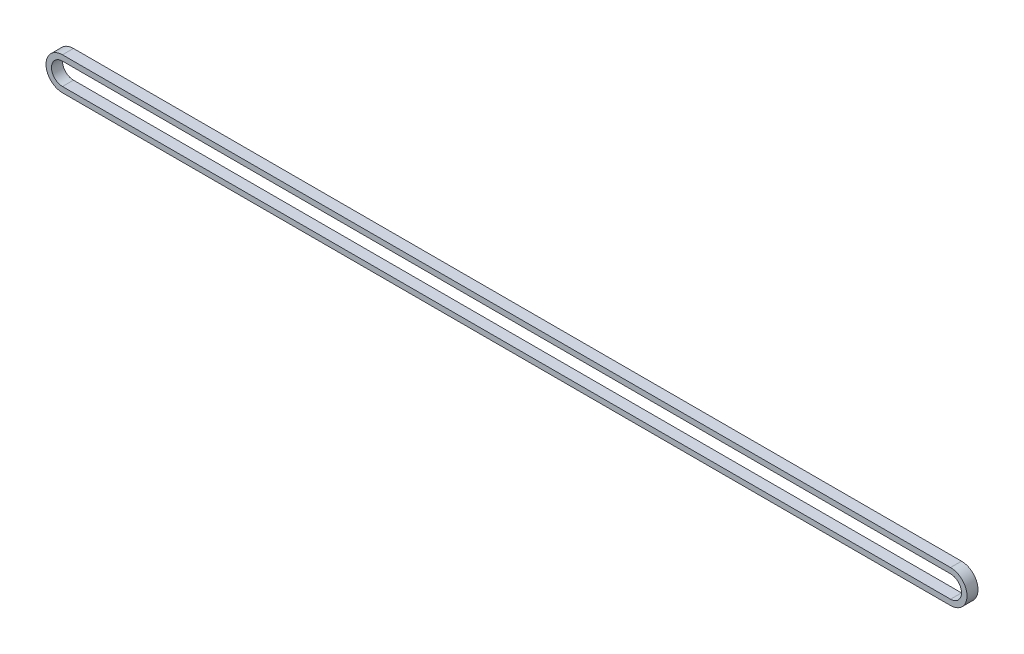
ISO-10303-21;
HEADER;
FILE_DESCRIPTION(('STEP AP214'),'2;1');
FILE_NAME('part.step','',(''),(''),'','','');
FILE_SCHEMA(('AUTOMOTIVE_DESIGN { 1 0 10303 214 1 1 1 1 }'));
ENDSEC;
DATA;
#1=APPLICATION_CONTEXT('core data for automotive mechanical design processes');
#2=APPLICATION_PROTOCOL_DEFINITION('international standard','automotive_design',2000,#1);
#3=PRODUCT_CONTEXT('',#1,'mechanical');
#4=PRODUCT('Part','Part','',(#3));
#5=PRODUCT_RELATED_PRODUCT_CATEGORY('part','',(#4));
#6=PRODUCT_DEFINITION_FORMATION('','',#4);
#7=PRODUCT_DEFINITION_CONTEXT('part definition',#1,'design');
#8=PRODUCT_DEFINITION('design','',#6,#7);
#9=PRODUCT_DEFINITION_SHAPE('','',#8);
#10=(LENGTH_UNIT() NAMED_UNIT(*) SI_UNIT(.MILLI.,.METRE.));
#11=(NAMED_UNIT(*) PLANE_ANGLE_UNIT() SI_UNIT($,.RADIAN.));
#12=(NAMED_UNIT(*) SI_UNIT($,.STERADIAN.) SOLID_ANGLE_UNIT());
#13=UNCERTAINTY_MEASURE_WITH_UNIT(LENGTH_MEASURE(1.E-05),#10,'distance_accuracy_value','');
#14=(GEOMETRIC_REPRESENTATION_CONTEXT(3) GLOBAL_UNCERTAINTY_ASSIGNED_CONTEXT((#13)) GLOBAL_UNIT_ASSIGNED_CONTEXT((#10,
#11,#12)) REPRESENTATION_CONTEXT('',''));
#15=CARTESIAN_POINT('',(0.,0.,0.));
#16=DIRECTION('',(0.,0.,1.));
#17=DIRECTION('',(1.,0.,0.));
#18=AXIS2_PLACEMENT_3D('',#15,#16,#17);
#19=CARTESIAN_POINT('',(242.5,0.,6.));
#20=DIRECTION('',(0.,0.,-1.));
#21=DIRECTION('',(-1.,0.,0.));
#22=AXIS2_PLACEMENT_3D('',#19,#20,#21);
#23=PLANE('',#22);
#24=CARTESIAN_POINT('',(242.5,0.,6.));
#25=DIRECTION('',(0.,0.,1.));
#26=DIRECTION('',(-1.,0.,0.));
#27=AXIS2_PLACEMENT_3D('',#24,#25,#26);
#28=CIRCLE('',#27,9.00000000000001);
#29=CARTESIAN_POINT('',(242.5,-9.00000000000001,6.));
#30=VERTEX_POINT('',#29);
#31=CARTESIAN_POINT('',(242.5,9.00000000000001,6.));
#32=VERTEX_POINT('',#31);
#33=EDGE_CURVE('E140',#30,#32,#28,.T.);
#34=ORIENTED_EDGE('',*,*,#33,.T.);
#35=DIRECTION('',(-1.,0.,0.));
#36=VECTOR('',#35,1.);
#37=CARTESIAN_POINT('',(-242.5,9.00000000000001,6.));
#38=LINE('',#37,#36);
#39=CARTESIAN_POINT('',(-242.5,9.00000000000001,6.));
#40=VERTEX_POINT('',#39);
#41=EDGE_CURVE('E143',#32,#40,#38,.T.);
#42=ORIENTED_EDGE('',*,*,#41,.T.);
#43=CARTESIAN_POINT('',(-242.5,0.,6.));
#44=DIRECTION('',(0.,0.,1.));
#45=DIRECTION('',(1.,0.,0.));
#46=AXIS2_PLACEMENT_3D('',#43,#44,#45);
#47=CIRCLE('',#46,9.00000000000001);
#48=CARTESIAN_POINT('',(-242.5,-9.00000000000001,6.));
#49=VERTEX_POINT('',#48);
#50=EDGE_CURVE('E146',#40,#49,#47,.T.);
#51=ORIENTED_EDGE('',*,*,#50,.T.);
#52=DIRECTION('',(1.,0.,0.));
#53=VECTOR('',#52,1.);
#54=CARTESIAN_POINT('',(242.5,-9.00000000000001,6.));
#55=LINE('',#54,#53);
#56=EDGE_CURVE('E148',#49,#30,#55,.T.);
#57=ORIENTED_EDGE('',*,*,#56,.T.);
#58=EDGE_LOOP('',(#34,#42,#51,#57));
#59=FACE_BOUND('',#58,.T.);
#60=CARTESIAN_POINT('',(-242.5,0.,6.));
#61=DIRECTION('',(0.,0.,1.));
#62=DIRECTION('',(1.,0.,0.));
#63=AXIS2_PLACEMENT_3D('',#60,#61,#62);
#64=CIRCLE('',#63,6.00000000000002);
#65=CARTESIAN_POINT('',(-242.5,6.00000000000002,6.));
#66=VERTEX_POINT('',#65);
#67=CARTESIAN_POINT('',(-242.5,-6.00000000000002,6.));
#68=VERTEX_POINT('',#67);
#69=EDGE_CURVE('E104',#66,#68,#64,.T.);
#70=ORIENTED_EDGE('',*,*,#69,.F.);
#71=DIRECTION('',(-1.,0.,0.));
#72=VECTOR('',#71,1.);
#73=CARTESIAN_POINT('',(242.5,6.00000000000002,6.));
#74=LINE('',#73,#72);
#75=CARTESIAN_POINT('',(242.5,6.00000000000002,6.));
#76=VERTEX_POINT('',#75);
#77=EDGE_CURVE('E126',#76,#66,#74,.T.);
#78=ORIENTED_EDGE('',*,*,#77,.F.);
#79=CARTESIAN_POINT('',(242.5,0.,6.));
#80=DIRECTION('',(0.,0.,1.));
#81=DIRECTION('',(-1.,0.,0.));
#82=AXIS2_PLACEMENT_3D('',#79,#80,#81);
#83=CIRCLE('',#82,6.00000000000002);
#84=CARTESIAN_POINT('',(242.5,-6.00000000000002,6.));
#85=VERTEX_POINT('',#84);
#86=EDGE_CURVE('E124',#85,#76,#83,.T.);
#87=ORIENTED_EDGE('',*,*,#86,.F.);
#88=DIRECTION('',(1.,0.,0.));
#89=VECTOR('',#88,1.);
#90=CARTESIAN_POINT('',(-242.5,-6.00000000000002,6.));
#91=LINE('',#90,#89);
#92=EDGE_CURVE('E112',#68,#85,#91,.T.);
#93=ORIENTED_EDGE('',*,*,#92,.F.);
#94=EDGE_LOOP('',(#70,#78,#87,#93));
#95=FACE_BOUND('',#94,.T.);
#96=ADVANCED_FACE('F39',(#59,#95),#23,.F.);
#97=CARTESIAN_POINT('',(242.5,0.,0.));
#98=DIRECTION('',(0.,0.,-1.));
#99=DIRECTION('',(-1.,0.,0.));
#100=AXIS2_PLACEMENT_3D('',#97,#98,#99);
#101=PLANE('',#100);
#102=CARTESIAN_POINT('',(242.5,0.,0.));
#103=DIRECTION('',(0.,0.,1.));
#104=DIRECTION('',(-1.,0.,0.));
#105=AXIS2_PLACEMENT_3D('',#102,#103,#104);
#106=CIRCLE('',#105,9.00000000000001);
#107=CARTESIAN_POINT('',(242.5,-9.00000000000001,0.));
#108=VERTEX_POINT('',#107);
#109=CARTESIAN_POINT('',(242.5,9.00000000000001,0.));
#110=VERTEX_POINT('',#109);
#111=EDGE_CURVE('E120',#108,#110,#106,.T.);
#112=ORIENTED_EDGE('',*,*,#111,.F.);
#113=DIRECTION('',(1.,0.,0.));
#114=VECTOR('',#113,1.);
#115=CARTESIAN_POINT('',(242.5,-9.00000000000001,0.));
#116=LINE('',#115,#114);
#117=CARTESIAN_POINT('',(-242.5,-9.00000000000001,0.));
#118=VERTEX_POINT('',#117);
#119=EDGE_CURVE('E144',#118,#108,#116,.T.);
#120=ORIENTED_EDGE('',*,*,#119,.F.);
#121=CARTESIAN_POINT('',(-242.5,0.,0.));
#122=DIRECTION('',(0.,0.,1.));
#123=DIRECTION('',(1.,0.,0.));
#124=AXIS2_PLACEMENT_3D('',#121,#122,#123);
#125=CIRCLE('',#124,9.00000000000001);
#126=CARTESIAN_POINT('',(-242.5,9.00000000000001,0.));
#127=VERTEX_POINT('',#126);
#128=EDGE_CURVE('E155',#127,#118,#125,.T.);
#129=ORIENTED_EDGE('',*,*,#128,.F.);
#130=DIRECTION('',(-1.,0.,0.));
#131=VECTOR('',#130,1.);
#132=CARTESIAN_POINT('',(-242.5,9.00000000000001,0.));
#133=LINE('',#132,#131);
#134=EDGE_CURVE('E153',#110,#127,#133,.T.);
#135=ORIENTED_EDGE('',*,*,#134,.F.);
#136=EDGE_LOOP('',(#112,#120,#129,#135));
#137=FACE_BOUND('',#136,.T.);
#138=DIRECTION('',(-1.,0.,0.));
#139=VECTOR('',#138,1.);
#140=CARTESIAN_POINT('',(242.5,6.00000000000002,0.));
#141=LINE('',#140,#139);
#142=CARTESIAN_POINT('',(242.5,6.00000000000002,0.));
#143=VERTEX_POINT('',#142);
#144=CARTESIAN_POINT('',(-242.5,6.00000000000002,0.));
#145=VERTEX_POINT('',#144);
#146=EDGE_CURVE('E113',#143,#145,#141,.T.);
#147=ORIENTED_EDGE('',*,*,#146,.T.);
#148=CARTESIAN_POINT('',(-242.5,0.,0.));
#149=DIRECTION('',(0.,0.,1.));
#150=DIRECTION('',(1.,0.,0.));
#151=AXIS2_PLACEMENT_3D('',#148,#149,#150);
#152=CIRCLE('',#151,6.00000000000002);
#153=CARTESIAN_POINT('',(-242.5,-6.00000000000002,0.));
#154=VERTEX_POINT('',#153);
#155=EDGE_CURVE('E62',#145,#154,#152,.T.);
#156=ORIENTED_EDGE('',*,*,#155,.T.);
#157=DIRECTION('',(1.,0.,0.));
#158=VECTOR('',#157,1.);
#159=CARTESIAN_POINT('',(-242.5,-6.00000000000002,0.));
#160=LINE('',#159,#158);
#161=CARTESIAN_POINT('',(242.5,-6.00000000000002,0.));
#162=VERTEX_POINT('',#161);
#163=EDGE_CURVE('E119',#154,#162,#160,.T.);
#164=ORIENTED_EDGE('',*,*,#163,.T.);
#165=CARTESIAN_POINT('',(242.5,0.,0.));
#166=DIRECTION('',(0.,0.,1.));
#167=DIRECTION('',(-1.,0.,0.));
#168=AXIS2_PLACEMENT_3D('',#165,#166,#167);
#169=CIRCLE('',#168,6.00000000000002);
#170=EDGE_CURVE('E132',#162,#143,#169,.T.);
#171=ORIENTED_EDGE('',*,*,#170,.T.);
#172=EDGE_LOOP('',(#147,#156,#164,#171));
#173=FACE_BOUND('',#172,.T.);
#174=ADVANCED_FACE('F173',(#137,#173),#101,.T.);
#175=CARTESIAN_POINT('',(242.5,0.,6.));
#176=DIRECTION('',(0.,0.,-1.));
#177=DIRECTION('',(-1.,0.,0.));
#178=AXIS2_PLACEMENT_3D('',#175,#176,#177);
#179=CYLINDRICAL_SURFACE('',#178,9.00000000000001);
#180=ORIENTED_EDGE('',*,*,#111,.T.);
#181=DIRECTION('',(0.,0.,-1.));
#182=VECTOR('',#181,1.);
#183=CARTESIAN_POINT('',(242.5,9.00000000000001,6.));
#184=LINE('',#183,#182);
#185=EDGE_CURVE('E11',#32,#110,#184,.T.);
#186=ORIENTED_EDGE('',*,*,#185,.F.);
#187=ORIENTED_EDGE('',*,*,#33,.F.);
#188=DIRECTION('',(0.,0.,-1.));
#189=VECTOR('',#188,1.);
#190=CARTESIAN_POINT('',(242.5,-9.00000000000001,6.));
#191=LINE('',#190,#189);
#192=EDGE_CURVE('E150',#30,#108,#191,.T.);
#193=ORIENTED_EDGE('',*,*,#192,.T.);
#194=EDGE_LOOP('',(#180,#186,#187,#193));
#195=FACE_BOUND('',#194,.T.);
#196=ADVANCED_FACE('F41',(#195),#179,.T.);
#197=CARTESIAN_POINT('',(-242.5,9.00000000000001,6.));
#198=DIRECTION('',(0.,-1.,0.));
#199=DIRECTION('',(0.,0.,-1.));
#200=AXIS2_PLACEMENT_3D('',#197,#198,#199);
#201=PLANE('',#200);
#202=ORIENTED_EDGE('',*,*,#134,.T.);
#203=DIRECTION('',(0.,0.,-1.));
#204=VECTOR('',#203,1.);
#205=CARTESIAN_POINT('',(-242.5,9.00000000000001,6.));
#206=LINE('',#205,#204);
#207=EDGE_CURVE('E47',#40,#127,#206,.T.);
#208=ORIENTED_EDGE('',*,*,#207,.F.);
#209=ORIENTED_EDGE('',*,*,#41,.F.);
#210=ORIENTED_EDGE('',*,*,#185,.T.);
#211=EDGE_LOOP('',(#202,#208,#209,#210));
#212=FACE_BOUND('',#211,.T.);
#213=ADVANCED_FACE('F183',(#212),#201,.F.);
#214=CARTESIAN_POINT('',(-242.5,0.,6.));
#215=DIRECTION('',(0.,0.,-1.));
#216=DIRECTION('',(-1.,0.,0.));
#217=AXIS2_PLACEMENT_3D('',#214,#215,#216);
#218=CYLINDRICAL_SURFACE('',#217,9.00000000000001);
#219=ORIENTED_EDGE('',*,*,#128,.T.);
#220=DIRECTION('',(0.,0.,-1.));
#221=VECTOR('',#220,1.);
#222=CARTESIAN_POINT('',(-242.5,-9.00000000000001,6.));
#223=LINE('',#222,#221);
#224=EDGE_CURVE('E160',#49,#118,#223,.T.);
#225=ORIENTED_EDGE('',*,*,#224,.F.);
#226=ORIENTED_EDGE('',*,*,#50,.F.);
#227=ORIENTED_EDGE('',*,*,#207,.T.);
#228=EDGE_LOOP('',(#219,#225,#226,#227));
#229=FACE_BOUND('',#228,.T.);
#230=ADVANCED_FACE('F167',(#229),#218,.T.);
#231=CARTESIAN_POINT('',(242.5,-9.00000000000001,6.));
#232=DIRECTION('',(0.,1.,0.));
#233=DIRECTION('',(0.,0.,1.));
#234=AXIS2_PLACEMENT_3D('',#231,#232,#233);
#235=PLANE('',#234);
#236=ORIENTED_EDGE('',*,*,#119,.T.);
#237=ORIENTED_EDGE('',*,*,#192,.F.);
#238=ORIENTED_EDGE('',*,*,#56,.F.);
#239=ORIENTED_EDGE('',*,*,#224,.T.);
#240=EDGE_LOOP('',(#236,#237,#238,#239));
#241=FACE_BOUND('',#240,.T.);
#242=ADVANCED_FACE('F177',(#241),#235,.F.);
#243=CARTESIAN_POINT('',(-242.5,0.,6.));
#244=DIRECTION('',(0.,0.,-1.));
#245=DIRECTION('',(-1.,0.,0.));
#246=AXIS2_PLACEMENT_3D('',#243,#244,#245);
#247=CYLINDRICAL_SURFACE('',#246,6.00000000000002);
#248=ORIENTED_EDGE('',*,*,#155,.F.);
#249=DIRECTION('',(0.,0.,-1.));
#250=VECTOR('',#249,1.);
#251=CARTESIAN_POINT('',(-242.5,6.00000000000002,6.));
#252=LINE('',#251,#250);
#253=EDGE_CURVE('E108',#66,#145,#252,.T.);
#254=ORIENTED_EDGE('',*,*,#253,.F.);
#255=ORIENTED_EDGE('',*,*,#69,.T.);
#256=DIRECTION('',(0.,0.,-1.));
#257=VECTOR('',#256,1.);
#258=CARTESIAN_POINT('',(-242.5,-6.00000000000002,6.));
#259=LINE('',#258,#257);
#260=EDGE_CURVE('E107',#68,#154,#259,.T.);
#261=ORIENTED_EDGE('',*,*,#260,.T.);
#262=EDGE_LOOP('',(#248,#254,#255,#261));
#263=FACE_BOUND('',#262,.T.);
#264=ADVANCED_FACE('F106',(#263),#247,.F.);
#265=CARTESIAN_POINT('',(-242.5,-6.00000000000002,6.));
#266=DIRECTION('',(0.,1.,0.));
#267=DIRECTION('',(0.,0.,1.));
#268=AXIS2_PLACEMENT_3D('',#265,#266,#267);
#269=PLANE('',#268);
#270=ORIENTED_EDGE('',*,*,#163,.F.);
#271=ORIENTED_EDGE('',*,*,#260,.F.);
#272=ORIENTED_EDGE('',*,*,#92,.T.);
#273=DIRECTION('',(0.,0.,-1.));
#274=VECTOR('',#273,1.);
#275=CARTESIAN_POINT('',(242.5,-6.00000000000002,6.));
#276=LINE('',#275,#274);
#277=EDGE_CURVE('E121',#85,#162,#276,.T.);
#278=ORIENTED_EDGE('',*,*,#277,.T.);
#279=EDGE_LOOP('',(#270,#271,#272,#278));
#280=FACE_BOUND('',#279,.T.);
#281=ADVANCED_FACE('F116',(#280),#269,.T.);
#282=CARTESIAN_POINT('',(242.5,0.,6.));
#283=DIRECTION('',(0.,0.,-1.));
#284=DIRECTION('',(-1.,0.,0.));
#285=AXIS2_PLACEMENT_3D('',#282,#283,#284);
#286=CYLINDRICAL_SURFACE('',#285,6.00000000000002);
#287=ORIENTED_EDGE('',*,*,#170,.F.);
#288=ORIENTED_EDGE('',*,*,#277,.F.);
#289=ORIENTED_EDGE('',*,*,#86,.T.);
#290=DIRECTION('',(0.,0.,-1.));
#291=VECTOR('',#290,1.);
#292=CARTESIAN_POINT('',(242.5,6.00000000000002,6.));
#293=LINE('',#292,#291);
#294=EDGE_CURVE('E54',#76,#143,#293,.T.);
#295=ORIENTED_EDGE('',*,*,#294,.T.);
#296=EDGE_LOOP('',(#287,#288,#289,#295));
#297=FACE_BOUND('',#296,.T.);
#298=ADVANCED_FACE('F206',(#297),#286,.F.);
#299=CARTESIAN_POINT('',(242.5,6.00000000000002,6.));
#300=DIRECTION('',(0.,-1.,0.));
#301=DIRECTION('',(0.,0.,-1.));
#302=AXIS2_PLACEMENT_3D('',#299,#300,#301);
#303=PLANE('',#302);
#304=ORIENTED_EDGE('',*,*,#146,.F.);
#305=ORIENTED_EDGE('',*,*,#294,.F.);
#306=ORIENTED_EDGE('',*,*,#77,.T.);
#307=ORIENTED_EDGE('',*,*,#253,.T.);
#308=EDGE_LOOP('',(#304,#305,#306,#307));
#309=FACE_BOUND('',#308,.T.);
#310=ADVANCED_FACE('F210',(#309),#303,.T.);
#311=CLOSED_SHELL('',(#96,#174,#196,#213,#230,#242,#264,#281,#298,#310));
#312=MANIFOLD_SOLID_BREP('B2',#311);
#313=ADVANCED_BREP_SHAPE_REPRESENTATION('',(#18,#312),#14);
#314=SHAPE_DEFINITION_REPRESENTATION(#9,#313);
ENDSEC;
END-ISO-10303-21;
